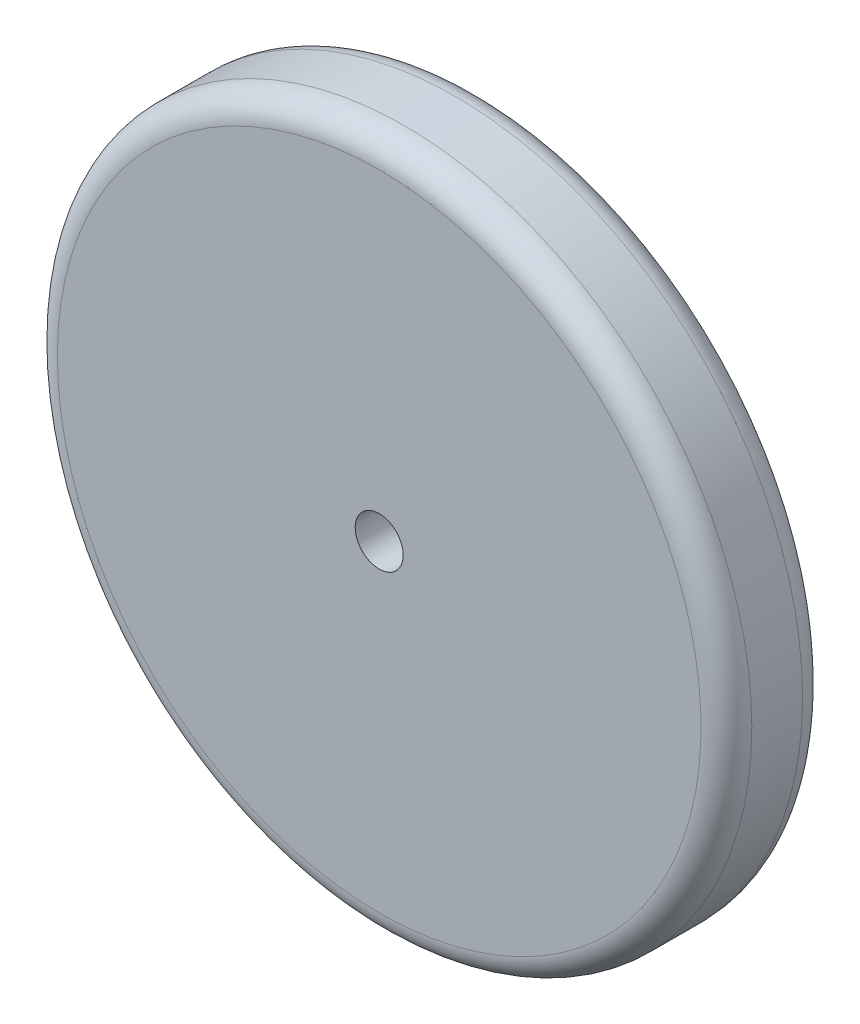
ISO-10303-21;
HEADER;
FILE_DESCRIPTION(('STEP AP214'),'2;1');
FILE_NAME('part.step','',(''),(''),'','','');
FILE_SCHEMA(('AUTOMOTIVE_DESIGN { 1 0 10303 214 1 1 1 1 }'));
ENDSEC;
DATA;
#1=APPLICATION_CONTEXT('core data for automotive mechanical design processes');
#2=APPLICATION_PROTOCOL_DEFINITION('international standard','automotive_design',2000,#1);
#3=PRODUCT_CONTEXT('',#1,'mechanical');
#4=PRODUCT('Part','Part','',(#3));
#5=PRODUCT_RELATED_PRODUCT_CATEGORY('part','',(#4));
#6=PRODUCT_DEFINITION_FORMATION('','',#4);
#7=PRODUCT_DEFINITION_CONTEXT('part definition',#1,'design');
#8=PRODUCT_DEFINITION('design','',#6,#7);
#9=PRODUCT_DEFINITION_SHAPE('','',#8);
#10=(LENGTH_UNIT() NAMED_UNIT(*) SI_UNIT(.MILLI.,.METRE.));
#11=(NAMED_UNIT(*) PLANE_ANGLE_UNIT() SI_UNIT($,.RADIAN.));
#12=(NAMED_UNIT(*) SI_UNIT($,.STERADIAN.) SOLID_ANGLE_UNIT());
#13=UNCERTAINTY_MEASURE_WITH_UNIT(LENGTH_MEASURE(1.E-05),#10,'distance_accuracy_value','');
#14=(GEOMETRIC_REPRESENTATION_CONTEXT(3) GLOBAL_UNCERTAINTY_ASSIGNED_CONTEXT((#13)) GLOBAL_UNIT_ASSIGNED_CONTEXT((#10,
#11,#12)) REPRESENTATION_CONTEXT('',''));
#15=CARTESIAN_POINT('',(0.,0.,0.));
#16=DIRECTION('',(0.,0.,1.));
#17=DIRECTION('',(1.,0.,0.));
#18=AXIS2_PLACEMENT_3D('',#15,#16,#17);
#19=CARTESIAN_POINT('',(-7.,0.,0.));
#20=DIRECTION('',(0.,0.,1.));
#21=DIRECTION('',(-1.,0.,0.));
#22=AXIS2_PLACEMENT_3D('',#19,#20,#21);
#23=CYLINDRICAL_SURFACE('',#22,6.);
#24=CARTESIAN_POINT('',(-7.,0.,0.));
#25=DIRECTION('',(0.,0.,-1.));
#26=DIRECTION('',(-1.,0.,0.));
#27=AXIS2_PLACEMENT_3D('',#24,#25,#26);
#28=CIRCLE('',#27,6.);
#29=CARTESIAN_POINT('',(-13.,0.,0.));
#30=VERTEX_POINT('',#29);
#31=EDGE_CURVE('E31',#30,#30,#28,.T.);
#32=ORIENTED_EDGE('',*,*,#31,.T.);
#33=EDGE_LOOP('',(#32));
#34=FACE_BOUND('',#33,.T.);
#35=CARTESIAN_POINT('',(-7.,0.,25.4));
#36=DIRECTION('',(0.,0.,-1.));
#37=DIRECTION('',(-1.,0.,0.));
#38=AXIS2_PLACEMENT_3D('',#35,#36,#37);
#39=CIRCLE('',#38,6.);
#40=CARTESIAN_POINT('',(-13.,0.,25.4));
#41=VERTEX_POINT('',#40);
#42=EDGE_CURVE('E10',#41,#41,#39,.T.);
#43=ORIENTED_EDGE('',*,*,#42,.F.);
#44=EDGE_LOOP('',(#43));
#45=FACE_BOUND('',#44,.T.);
#46=ADVANCED_FACE('F15',(#34,#45),#23,.F.);
#47=CARTESIAN_POINT('',(-7.,0.,25.4));
#48=DIRECTION('',(0.,0.,1.));
#49=DIRECTION('',(1.,0.,0.));
#50=AXIS2_PLACEMENT_3D('',#47,#48,#49);
#51=PLANE('',#50);
#52=ORIENTED_EDGE('',*,*,#42,.T.);
#53=EDGE_LOOP('',(#52));
#54=FACE_BOUND('',#53,.T.);
#55=CARTESIAN_POINT('',(-7.,0.,25.4));
#56=DIRECTION('',(0.,0.,-1.));
#57=DIRECTION('',(-1.,0.,0.));
#58=AXIS2_PLACEMENT_3D('',#55,#56,#57);
#59=CIRCLE('',#58,80.4417389790418);
#60=CARTESIAN_POINT('',(-87.4417389790418,0.,25.4));
#61=VERTEX_POINT('',#60);
#62=EDGE_CURVE('E18',#61,#61,#59,.T.);
#63=ORIENTED_EDGE('',*,*,#62,.F.);
#64=EDGE_LOOP('',(#63));
#65=FACE_BOUND('',#64,.T.);
#66=ADVANCED_FACE('F63',(#54,#65),#51,.T.);
#67=CARTESIAN_POINT('',(-7.,0.,19.05));
#68=DIRECTION('',(0.,0.,1.));
#69=DIRECTION('',(1.,0.,0.));
#70=AXIS2_PLACEMENT_3D('',#67,#68,#69);
#71=TOROIDAL_SURFACE('',#70,80.4417389790418,6.35);
#72=CARTESIAN_POINT('',(-7.,0.,19.05));
#73=DIRECTION('',(0.,0.,1.));
#74=DIRECTION('',(-1.,0.,0.));
#75=AXIS2_PLACEMENT_3D('',#72,#73,#74);
#76=CIRCLE('',#75,86.7917389790418);
#77=CARTESIAN_POINT('',(-93.7917389790418,0.,19.05));
#78=VERTEX_POINT('',#77);
#79=EDGE_CURVE('E36',#78,#78,#76,.T.);
#80=ORIENTED_EDGE('',*,*,#79,.T.);
#81=EDGE_LOOP('',(#80));
#82=FACE_BOUND('',#81,.T.);
#83=ORIENTED_EDGE('',*,*,#62,.T.);
#84=EDGE_LOOP('',(#83));
#85=FACE_BOUND('',#84,.T.);
#86=ADVANCED_FACE('F60',(#82,#85),#71,.T.);
#87=CARTESIAN_POINT('',(-7.,0.,0.));
#88=DIRECTION('',(0.,0.,1.));
#89=DIRECTION('',(1.,0.,0.));
#90=AXIS2_PLACEMENT_3D('',#87,#88,#89);
#91=PLANE('',#90);
#92=ORIENTED_EDGE('',*,*,#31,.F.);
#93=EDGE_LOOP('',(#92));
#94=FACE_BOUND('',#93,.T.);
#95=CARTESIAN_POINT('',(-7.,0.,0.));
#96=DIRECTION('',(0.,0.,1.));
#97=DIRECTION('',(-1.,0.,0.));
#98=AXIS2_PLACEMENT_3D('',#95,#96,#97);
#99=CIRCLE('',#98,80.4417389790418);
#100=CARTESIAN_POINT('',(-87.4417389790418,0.,0.));
#101=VERTEX_POINT('',#100);
#102=EDGE_CURVE('E37',#101,#101,#99,.T.);
#103=ORIENTED_EDGE('',*,*,#102,.F.);
#104=EDGE_LOOP('',(#103));
#105=FACE_BOUND('',#104,.T.);
#106=ADVANCED_FACE('F56',(#94,#105),#91,.F.);
#107=CARTESIAN_POINT('',(-7.,0.,0.));
#108=DIRECTION('',(0.,0.,1.));
#109=DIRECTION('',(1.,0.,0.));
#110=AXIS2_PLACEMENT_3D('',#107,#108,#109);
#111=CYLINDRICAL_SURFACE('',#110,86.7917389790418);
#112=CARTESIAN_POINT('',(-7.,0.,6.35));
#113=DIRECTION('',(0.,0.,-1.));
#114=DIRECTION('',(-1.,0.,0.));
#115=AXIS2_PLACEMENT_3D('',#112,#113,#114);
#116=CIRCLE('',#115,86.7917389790418);
#117=CARTESIAN_POINT('',(-93.7917389790418,0.,6.35));
#118=VERTEX_POINT('',#117);
#119=EDGE_CURVE('E41',#118,#118,#116,.T.);
#120=ORIENTED_EDGE('',*,*,#119,.F.);
#121=EDGE_LOOP('',(#120));
#122=FACE_BOUND('',#121,.T.);
#123=ORIENTED_EDGE('',*,*,#79,.F.);
#124=EDGE_LOOP('',(#123));
#125=FACE_BOUND('',#124,.T.);
#126=ADVANCED_FACE('F53',(#122,#125),#111,.T.);
#127=CARTESIAN_POINT('',(-7.,0.,6.35));
#128=DIRECTION('',(0.,0.,1.));
#129=DIRECTION('',(1.,0.,0.));
#130=AXIS2_PLACEMENT_3D('',#127,#128,#129);
#131=TOROIDAL_SURFACE('',#130,80.4417389790418,6.35);
#132=ORIENTED_EDGE('',*,*,#102,.T.);
#133=EDGE_LOOP('',(#132));
#134=FACE_BOUND('',#133,.T.);
#135=ORIENTED_EDGE('',*,*,#119,.T.);
#136=EDGE_LOOP('',(#135));
#137=FACE_BOUND('',#136,.T.);
#138=ADVANCED_FACE('F51',(#134,#137),#131,.T.);
#139=CLOSED_SHELL('',(#46,#66,#86,#106,#126,#138));
#140=MANIFOLD_SOLID_BREP('B1',#139);
#141=ADVANCED_BREP_SHAPE_REPRESENTATION('',(#18,#140),#14);
#142=SHAPE_DEFINITION_REPRESENTATION(#9,#141);
ENDSEC;
END-ISO-10303-21;
